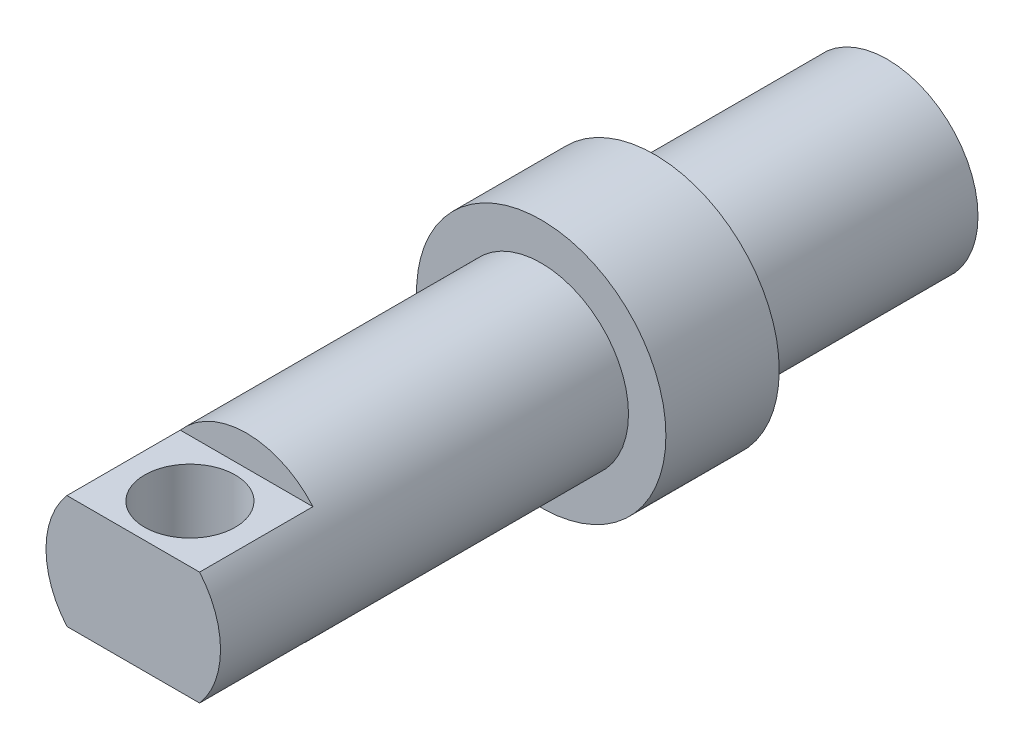
ISO-10303-21;
HEADER;
FILE_DESCRIPTION(('STEP AP214'),'2;1');
FILE_NAME('part.step','',(''),(''),'','','');
FILE_SCHEMA(('AUTOMOTIVE_DESIGN { 1 0 10303 214 1 1 1 1 }'));
ENDSEC;
DATA;
#1=APPLICATION_CONTEXT('core data for automotive mechanical design processes');
#2=APPLICATION_PROTOCOL_DEFINITION('international standard','automotive_design',2000,#1);
#3=PRODUCT_CONTEXT('',#1,'mechanical');
#4=PRODUCT('Part','Part','',(#3));
#5=PRODUCT_RELATED_PRODUCT_CATEGORY('part','',(#4));
#6=PRODUCT_DEFINITION_FORMATION('','',#4);
#7=PRODUCT_DEFINITION_CONTEXT('part definition',#1,'design');
#8=PRODUCT_DEFINITION('design','',#6,#7);
#9=PRODUCT_DEFINITION_SHAPE('','',#8);
#10=(LENGTH_UNIT() NAMED_UNIT(*) SI_UNIT(.MILLI.,.METRE.));
#11=(NAMED_UNIT(*) PLANE_ANGLE_UNIT() SI_UNIT($,.RADIAN.));
#12=(NAMED_UNIT(*) SI_UNIT($,.STERADIAN.) SOLID_ANGLE_UNIT());
#13=UNCERTAINTY_MEASURE_WITH_UNIT(LENGTH_MEASURE(1.E-05),#10,'distance_accuracy_value','');
#14=(GEOMETRIC_REPRESENTATION_CONTEXT(3) GLOBAL_UNCERTAINTY_ASSIGNED_CONTEXT((#13)) GLOBAL_UNIT_ASSIGNED_CONTEXT((#10,
#11,#12)) REPRESENTATION_CONTEXT('',''));
#15=CARTESIAN_POINT('',(0.,0.,0.));
#16=DIRECTION('',(0.,0.,1.));
#17=DIRECTION('',(1.,0.,0.));
#18=AXIS2_PLACEMENT_3D('',#15,#16,#17);
#19=CARTESIAN_POINT('',(0.,7.15,19.77));
#20=DIRECTION('',(0.,0.,1.));
#21=DIRECTION('',(1.,0.,0.));
#22=AXIS2_PLACEMENT_3D('',#19,#20,#21);
#23=PLANE('',#22);
#24=CARTESIAN_POINT('',(0.,7.15,19.77));
#25=DIRECTION('',(0.,0.,1.));
#26=DIRECTION('',(1.,0.,0.));
#27=AXIS2_PLACEMENT_3D('',#24,#25,#26);
#28=CIRCLE('',#27,3.85);
#29=CARTESIAN_POINT('',(2.92617170234075,9.65200303125721,19.77));
#30=VERTEX_POINT('',#29);
#31=CARTESIAN_POINT('',(-2.92617170234075,9.65200303125721,19.77));
#32=VERTEX_POINT('',#31);
#33=EDGE_CURVE('E114',#30,#32,#28,.T.);
#34=ORIENTED_EDGE('',*,*,#33,.T.);
#35=DIRECTION('',(1.,0.,0.));
#36=VECTOR('',#35,1.);
#37=CARTESIAN_POINT('',(0.,9.65200303125721,19.77));
#38=LINE('',#37,#36);
#39=EDGE_CURVE('E135',#32,#30,#38,.T.);
#40=ORIENTED_EDGE('',*,*,#39,.T.);
#41=EDGE_LOOP('',(#34,#40));
#42=FACE_BOUND('',#41,.T.);
#43=ADVANCED_FACE('F17',(#42),#23,.T.);
#44=CARTESIAN_POINT('',(0.,7.15,1.77));
#45=DIRECTION('',(0.,0.,-1.));
#46=DIRECTION('',(-1.,0.,0.));
#47=AXIS2_PLACEMENT_3D('',#44,#45,#46);
#48=CYLINDRICAL_SURFACE('',#47,3.00000000000033);
#49=CARTESIAN_POINT('',(0.,7.15,-8.5));
#50=DIRECTION('',(0.,0.,1.));
#51=DIRECTION('',(1.,0.,0.));
#52=AXIS2_PLACEMENT_3D('',#49,#50,#51);
#53=CIRCLE('',#52,3.00000000000033);
#54=CARTESIAN_POINT('',(-2.99984998124639,7.1199984997371,-8.5));
#55=VERTEX_POINT('',#54);
#56=CARTESIAN_POINT('',(-0.0300015002628589,4.15015001875363,-8.5));
#57=VERTEX_POINT('',#56);
#58=EDGE_CURVE('E84',#55,#57,#53,.T.);
#59=ORIENTED_EDGE('',*,*,#58,.F.);
#60=DIRECTION('',(0.,0.,-1.));
#61=VECTOR('',#60,1.);
#62=CARTESIAN_POINT('',(-2.99984998124639,7.1199984997371,1.77));
#63=LINE('',#62,#61);
#64=CARTESIAN_POINT('',(-2.99984998124639,7.1199984997371,1.77));
#65=VERTEX_POINT('',#64);
#66=EDGE_CURVE('E26',#65,#55,#63,.T.);
#67=ORIENTED_EDGE('',*,*,#66,.F.);
#68=CARTESIAN_POINT('',(0.,7.15,1.77));
#69=DIRECTION('',(0.,0.,1.));
#70=DIRECTION('',(1.,0.,0.));
#71=AXIS2_PLACEMENT_3D('',#68,#69,#70);
#72=CIRCLE('',#71,3.00000000000033);
#73=CARTESIAN_POINT('',(-0.0300015002628589,4.15015001875363,1.77));
#74=VERTEX_POINT('',#73);
#75=EDGE_CURVE('E88',#65,#74,#72,.T.);
#76=ORIENTED_EDGE('',*,*,#75,.T.);
#77=DIRECTION('',(0.,0.,-1.));
#78=VECTOR('',#77,1.);
#79=CARTESIAN_POINT('',(-0.0300015002628589,4.15015001875363,1.77));
#80=LINE('',#79,#78);
#81=EDGE_CURVE('E70',#74,#57,#80,.T.);
#82=ORIENTED_EDGE('',*,*,#81,.T.);
#83=EDGE_LOOP('',(#59,#67,#76,#82));
#84=FACE_BOUND('',#83,.T.);
#85=ADVANCED_FACE('F100',(#84),#48,.F.);
#86=CARTESIAN_POINT('',(-5.05992424049177,5.05992424049168,1.77));
#87=DIRECTION('',(0.707106781186554,-0.707106781186541,0.));
#88=DIRECTION('',(0.707106781186541,0.707106781186554,0.));
#89=AXIS2_PLACEMENT_3D('',#86,#87,#88);
#90=PLANE('',#89);
#91=DIRECTION('',(-0.707106781186541,-0.707106781186554,0.));
#92=VECTOR('',#91,1.);
#93=CARTESIAN_POINT('',(-5.05992424049177,5.05992424049168,-8.5));
#94=LINE('',#93,#92);
#95=CARTESIAN_POINT('',(0.0300015002628607,10.1498499812464,-8.5));
#96=VERTEX_POINT('',#95);
#97=EDGE_CURVE('E79',#96,#55,#94,.T.);
#98=ORIENTED_EDGE('',*,*,#97,.F.);
#99=DIRECTION('',(0.,0.,-1.));
#100=VECTOR('',#99,1.);
#101=CARTESIAN_POINT('',(0.0300015002628607,10.1498499812464,1.77));
#102=LINE('',#101,#100);
#103=CARTESIAN_POINT('',(0.0300015002628607,10.1498499812464,1.77));
#104=VERTEX_POINT('',#103);
#105=EDGE_CURVE('E69',#104,#96,#102,.T.);
#106=ORIENTED_EDGE('',*,*,#105,.F.);
#107=DIRECTION('',(-0.707106781186541,-0.707106781186554,0.));
#108=VECTOR('',#107,1.);
#109=CARTESIAN_POINT('',(-5.05992424049177,5.05992424049168,1.77));
#110=LINE('',#109,#108);
#111=EDGE_CURVE('E97',#104,#65,#110,.T.);
#112=ORIENTED_EDGE('',*,*,#111,.T.);
#113=ORIENTED_EDGE('',*,*,#66,.T.);
#114=EDGE_LOOP('',(#98,#106,#112,#113));
#115=FACE_BOUND('',#114,.T.);
#116=ADVANCED_FACE('F96',(#115),#90,.T.);
#117=CARTESIAN_POINT('',(0.,7.15,1.77));
#118=DIRECTION('',(0.,0.,-1.));
#119=DIRECTION('',(-1.,0.,0.));
#120=AXIS2_PLACEMENT_3D('',#117,#118,#119);
#121=CYLINDRICAL_SURFACE('',#120,3.00000000000033);
#122=CARTESIAN_POINT('',(0.,7.15,-8.5));
#123=DIRECTION('',(0.,0.,1.));
#124=DIRECTION('',(1.,0.,0.));
#125=AXIS2_PLACEMENT_3D('',#122,#123,#124);
#126=CIRCLE('',#125,3.00000000000033);
#127=CARTESIAN_POINT('',(2.99984998124639,7.18000150026292,-8.5));
#128=VERTEX_POINT('',#127);
#129=EDGE_CURVE('E73',#128,#96,#126,.T.);
#130=ORIENTED_EDGE('',*,*,#129,.F.);
#131=DIRECTION('',(0.,0.,-1.));
#132=VECTOR('',#131,1.);
#133=CARTESIAN_POINT('',(2.99984998124639,7.18000150026292,1.77));
#134=LINE('',#133,#132);
#135=CARTESIAN_POINT('',(2.99984998124639,7.18000150026292,1.77));
#136=VERTEX_POINT('',#135);
#137=EDGE_CURVE('E61',#136,#128,#134,.T.);
#138=ORIENTED_EDGE('',*,*,#137,.F.);
#139=CARTESIAN_POINT('',(0.,7.15,1.77));
#140=DIRECTION('',(0.,0.,1.));
#141=DIRECTION('',(1.,0.,0.));
#142=AXIS2_PLACEMENT_3D('',#139,#140,#141);
#143=CIRCLE('',#142,3.00000000000033);
#144=EDGE_CURVE('E43',#136,#104,#143,.T.);
#145=ORIENTED_EDGE('',*,*,#144,.T.);
#146=ORIENTED_EDGE('',*,*,#105,.T.);
#147=EDGE_LOOP('',(#130,#138,#145,#146));
#148=FACE_BOUND('',#147,.T.);
#149=ADVANCED_FACE('F74',(#148),#121,.F.);
#150=CARTESIAN_POINT('',(0.,7.15,1.77));
#151=DIRECTION('',(0.,0.,-1.));
#152=DIRECTION('',(-1.,0.,0.));
#153=AXIS2_PLACEMENT_3D('',#150,#151,#152);
#154=CYLINDRICAL_SURFACE('',#153,4.);
#155=CARTESIAN_POINT('',(0.,7.15,1.77));
#156=DIRECTION('',(0.,0.,1.));
#157=DIRECTION('',(1.,0.,0.));
#158=AXIS2_PLACEMENT_3D('',#155,#156,#157);
#159=CIRCLE('',#158,4.);
#160=CARTESIAN_POINT('',(4.,7.15,1.77));
#161=VERTEX_POINT('',#160);
#162=EDGE_CURVE('E85',#161,#161,#159,.T.);
#163=ORIENTED_EDGE('',*,*,#162,.F.);
#164=EDGE_LOOP('',(#163));
#165=FACE_BOUND('',#164,.T.);
#166=CARTESIAN_POINT('',(0.,7.15,-8.5));
#167=DIRECTION('',(0.,0.,1.));
#168=DIRECTION('',(1.,0.,0.));
#169=AXIS2_PLACEMENT_3D('',#166,#167,#168);
#170=CIRCLE('',#169,4.);
#171=CARTESIAN_POINT('',(4.,7.15,-8.5));
#172=VERTEX_POINT('',#171);
#173=EDGE_CURVE('E101',#172,#172,#170,.T.);
#174=ORIENTED_EDGE('',*,*,#173,.T.);
#175=EDGE_LOOP('',(#174));
#176=FACE_BOUND('',#175,.T.);
#177=ADVANCED_FACE('F19',(#165,#176),#154,.T.);
#178=CARTESIAN_POINT('',(-2.09007575950824,2.0900757595082,1.77));
#179=DIRECTION('',(-0.707106781186554,0.707106781186542,0.));
#180=DIRECTION('',(-0.707106781186541,-0.707106781186554,0.));
#181=AXIS2_PLACEMENT_3D('',#178,#179,#180);
#182=PLANE('',#181);
#183=DIRECTION('',(0.707106781186542,0.707106781186554,0.));
#184=VECTOR('',#183,1.);
#185=CARTESIAN_POINT('',(-2.09007575950824,2.0900757595082,-8.5));
#186=LINE('',#185,#184);
#187=EDGE_CURVE('E66',#57,#128,#186,.T.);
#188=ORIENTED_EDGE('',*,*,#187,.F.);
#189=ORIENTED_EDGE('',*,*,#81,.F.);
#190=DIRECTION('',(0.707106781186542,0.707106781186554,0.));
#191=VECTOR('',#190,1.);
#192=CARTESIAN_POINT('',(-2.09007575950824,2.0900757595082,1.77));
#193=LINE('',#192,#191);
#194=EDGE_CURVE('E67',#74,#136,#193,.T.);
#195=ORIENTED_EDGE('',*,*,#194,.T.);
#196=ORIENTED_EDGE('',*,*,#137,.T.);
#197=EDGE_LOOP('',(#188,#189,#195,#196));
#198=FACE_BOUND('',#197,.T.);
#199=ADVANCED_FACE('F63',(#198),#182,.T.);
#200=CARTESIAN_POINT('',(0.,0.,-8.5));
#201=DIRECTION('',(0.,0.,1.));
#202=DIRECTION('',(1.,0.,0.));
#203=AXIS2_PLACEMENT_3D('',#200,#201,#202);
#204=PLANE('',#203);
#205=ORIENTED_EDGE('',*,*,#173,.F.);
#206=EDGE_LOOP('',(#205));
#207=FACE_BOUND('',#206,.T.);
#208=ORIENTED_EDGE('',*,*,#58,.T.);
#209=ORIENTED_EDGE('',*,*,#187,.T.);
#210=ORIENTED_EDGE('',*,*,#129,.T.);
#211=ORIENTED_EDGE('',*,*,#97,.T.);
#212=EDGE_LOOP('',(#208,#209,#210,#211));
#213=FACE_BOUND('',#212,.T.);
#214=ADVANCED_FACE('F82',(#207,#213),#204,.F.);
#215=CARTESIAN_POINT('',(0.,7.15,1.77));
#216=DIRECTION('',(0.,0.,1.));
#217=DIRECTION('',(1.,0.,0.));
#218=AXIS2_PLACEMENT_3D('',#215,#216,#217);
#219=PLANE('',#218);
#220=ORIENTED_EDGE('',*,*,#75,.F.);
#221=ORIENTED_EDGE('',*,*,#111,.F.);
#222=ORIENTED_EDGE('',*,*,#144,.F.);
#223=ORIENTED_EDGE('',*,*,#194,.F.);
#224=EDGE_LOOP('',(#220,#221,#222,#223));
#225=FACE_BOUND('',#224,.T.);
#226=ADVANCED_FACE('F216',(#225),#219,.F.);
#227=CARTESIAN_POINT('',(0.,7.15,1.77));
#228=DIRECTION('',(0.,0.,1.));
#229=DIRECTION('',(1.,0.,0.));
#230=AXIS2_PLACEMENT_3D('',#227,#228,#229);
#231=CIRCLE('',#230,5.5);
#232=CARTESIAN_POINT('',(5.5,7.15,1.77));
#233=VERTEX_POINT('',#232);
#234=EDGE_CURVE('E111',#233,#233,#231,.T.);
#235=ORIENTED_EDGE('',*,*,#234,.F.);
#236=EDGE_LOOP('',(#235));
#237=FACE_BOUND('',#236,.T.);
#238=ORIENTED_EDGE('',*,*,#162,.T.);
#239=EDGE_LOOP('',(#238));
#240=FACE_BOUND('',#239,.T.);
#241=ADVANCED_FACE('F218',(#237,#240),#219,.F.);
#242=CARTESIAN_POINT('',(0.,7.15,6.77));
#243=DIRECTION('',(0.,0.,-1.));
#244=DIRECTION('',(-1.,0.,0.));
#245=AXIS2_PLACEMENT_3D('',#242,#243,#244);
#246=CYLINDRICAL_SURFACE('',#245,5.5);
#247=CARTESIAN_POINT('',(0.,7.15,6.77));
#248=DIRECTION('',(0.,0.,1.));
#249=DIRECTION('',(1.,0.,0.));
#250=AXIS2_PLACEMENT_3D('',#247,#248,#249);
#251=CIRCLE('',#250,5.5);
#252=CARTESIAN_POINT('',(5.5,7.15,6.77));
#253=VERTEX_POINT('',#252);
#254=EDGE_CURVE('E106',#253,#253,#251,.T.);
#255=ORIENTED_EDGE('',*,*,#254,.F.);
#256=EDGE_LOOP('',(#255));
#257=FACE_BOUND('',#256,.T.);
#258=ORIENTED_EDGE('',*,*,#234,.T.);
#259=EDGE_LOOP('',(#258));
#260=FACE_BOUND('',#259,.T.);
#261=ADVANCED_FACE('F225',(#257,#260),#246,.T.);
#262=CARTESIAN_POINT('',(0.,7.15,6.77));
#263=DIRECTION('',(0.,0.,1.));
#264=DIRECTION('',(1.,0.,0.));
#265=AXIS2_PLACEMENT_3D('',#262,#263,#264);
#266=PLANE('',#265);
#267=CARTESIAN_POINT('',(0.,7.15,6.77));
#268=DIRECTION('',(0.,0.,1.));
#269=DIRECTION('',(1.,0.,0.));
#270=AXIS2_PLACEMENT_3D('',#267,#268,#269);
#271=CIRCLE('',#270,3.85);
#272=CARTESIAN_POINT('',(3.85,7.15,6.77));
#273=VERTEX_POINT('',#272);
#274=EDGE_CURVE('E11',#273,#273,#271,.T.);
#275=ORIENTED_EDGE('',*,*,#274,.F.);
#276=EDGE_LOOP('',(#275));
#277=FACE_BOUND('',#276,.T.);
#278=ORIENTED_EDGE('',*,*,#254,.T.);
#279=EDGE_LOOP('',(#278));
#280=FACE_BOUND('',#279,.T.);
#281=ADVANCED_FACE('F187',(#277,#280),#266,.T.);
#282=CARTESIAN_POINT('',(0.,7.15,19.77));
#283=DIRECTION('',(0.,0.,-1.));
#284=DIRECTION('',(-1.,0.,0.));
#285=AXIS2_PLACEMENT_3D('',#282,#283,#284);
#286=CYLINDRICAL_SURFACE('',#285,3.85);
#287=ORIENTED_EDGE('',*,*,#33,.F.);
#288=DIRECTION('',(0.,0.,-1.));
#289=VECTOR('',#288,1.);
#290=CARTESIAN_POINT('',(2.92617170234075,9.65200303125721,24.77));
#291=LINE('',#290,#289);
#292=CARTESIAN_POINT('',(2.92617170234075,9.65200303125721,24.77));
#293=VERTEX_POINT('',#292);
#294=EDGE_CURVE('E34',#293,#30,#291,.T.);
#295=ORIENTED_EDGE('',*,*,#294,.F.);
#296=CARTESIAN_POINT('',(0.,7.15,24.77));
#297=DIRECTION('',(0.,0.,1.));
#298=DIRECTION('',(1.,0.,0.));
#299=AXIS2_PLACEMENT_3D('',#296,#297,#298);
#300=CIRCLE('',#299,3.85);
#301=CARTESIAN_POINT('',(2.92617170234075,4.64799696874281,24.77));
#302=VERTEX_POINT('',#301);
#303=EDGE_CURVE('E134',#302,#293,#300,.T.);
#304=ORIENTED_EDGE('',*,*,#303,.F.);
#305=DIRECTION('',(0.,0.,-1.));
#306=VECTOR('',#305,1.);
#307=CARTESIAN_POINT('',(2.92617170234075,4.64799696874281,24.77));
#308=LINE('',#307,#306);
#309=CARTESIAN_POINT('',(2.92617170234075,4.64799696874281,19.77));
#310=VERTEX_POINT('',#309);
#311=EDGE_CURVE('E127',#302,#310,#308,.T.);
#312=ORIENTED_EDGE('',*,*,#311,.T.);
#313=CARTESIAN_POINT('',(-2.92617170234075,4.64799696874281,19.77));
#314=VERTEX_POINT('',#313);
#315=EDGE_CURVE('E119',#314,#310,#28,.T.);
#316=ORIENTED_EDGE('',*,*,#315,.F.);
#317=DIRECTION('',(0.,0.,-1.));
#318=VECTOR('',#317,1.);
#319=CARTESIAN_POINT('',(-2.92617170234075,4.64799696874281,24.77));
#320=LINE('',#319,#318);
#321=CARTESIAN_POINT('',(-2.92617170234075,4.64799696874281,24.77));
#322=VERTEX_POINT('',#321);
#323=EDGE_CURVE('E124',#322,#314,#320,.T.);
#324=ORIENTED_EDGE('',*,*,#323,.F.);
#325=CARTESIAN_POINT('',(0.,7.15,24.77));
#326=DIRECTION('',(0.,0.,1.));
#327=DIRECTION('',(1.,0.,0.));
#328=AXIS2_PLACEMENT_3D('',#325,#326,#327);
#329=CIRCLE('',#328,3.85);
#330=CARTESIAN_POINT('',(-2.92617170234075,9.65200303125721,24.77));
#331=VERTEX_POINT('',#330);
#332=EDGE_CURVE('E139',#331,#322,#329,.T.);
#333=ORIENTED_EDGE('',*,*,#332,.F.);
#334=DIRECTION('',(0.,0.,-1.));
#335=VECTOR('',#334,1.);
#336=CARTESIAN_POINT('',(-2.92617170234075,9.65200303125721,24.77));
#337=LINE('',#336,#335);
#338=EDGE_CURVE('E121',#331,#32,#337,.T.);
#339=ORIENTED_EDGE('',*,*,#338,.T.);
#340=EDGE_LOOP('',(#287,#295,#304,#312,#316,#324,#333,#339));
#341=FACE_BOUND('',#340,.T.);
#342=ORIENTED_EDGE('',*,*,#274,.T.);
#343=EDGE_LOOP('',(#342));
#344=FACE_BOUND('',#343,.T.);
#345=ADVANCED_FACE('F179',(#341,#344),#286,.T.);
#346=DIRECTION('',(1.,0.,0.));
#347=VECTOR('',#346,1.);
#348=CARTESIAN_POINT('',(0.,4.64799696874281,19.77));
#349=LINE('',#348,#347);
#350=EDGE_CURVE('E131',#314,#310,#349,.T.);
#351=ORIENTED_EDGE('',*,*,#350,.F.);
#352=ORIENTED_EDGE('',*,*,#315,.T.);
#353=EDGE_LOOP('',(#351,#352));
#354=FACE_BOUND('',#353,.T.);
#355=ADVANCED_FACE('F170',(#354),#23,.T.);
#356=CARTESIAN_POINT('',(0.,9.65200303125721,24.77));
#357=DIRECTION('',(0.,1.,0.));
#358=DIRECTION('',(0.,0.,1.));
#359=AXIS2_PLACEMENT_3D('',#356,#357,#358);
#360=PLANE('',#359);
#361=CARTESIAN_POINT('',(0.,9.65200303125721,22.27));
#362=DIRECTION('',(0.,1.,0.));
#363=DIRECTION('',(0.,0.,1.));
#364=AXIS2_PLACEMENT_3D('',#361,#362,#363);
#365=CIRCLE('',#364,2.);
#366=CARTESIAN_POINT('',(0.,9.65200303125721,24.27));
#367=VERTEX_POINT('',#366);
#368=EDGE_CURVE('E146',#367,#367,#365,.T.);
#369=ORIENTED_EDGE('',*,*,#368,.F.);
#370=EDGE_LOOP('',(#369));
#371=FACE_BOUND('',#370,.T.);
#372=ORIENTED_EDGE('',*,*,#39,.F.);
#373=ORIENTED_EDGE('',*,*,#338,.F.);
#374=DIRECTION('',(1.,0.,0.));
#375=VECTOR('',#374,1.);
#376=CARTESIAN_POINT('',(0.,9.65200303125721,24.77));
#377=LINE('',#376,#375);
#378=EDGE_CURVE('E142',#331,#293,#377,.T.);
#379=ORIENTED_EDGE('',*,*,#378,.T.);
#380=ORIENTED_EDGE('',*,*,#294,.T.);
#381=EDGE_LOOP('',(#372,#373,#379,#380));
#382=FACE_BOUND('',#381,.T.);
#383=ADVANCED_FACE('F178',(#371,#382),#360,.T.);
#384=CARTESIAN_POINT('',(0.,4.64799696874281,24.77));
#385=DIRECTION('',(0.,1.,0.));
#386=DIRECTION('',(0.,0.,1.));
#387=AXIS2_PLACEMENT_3D('',#384,#385,#386);
#388=PLANE('',#387);
#389=CARTESIAN_POINT('',(0.,4.64799696874281,22.27));
#390=DIRECTION('',(0.,1.,0.));
#391=DIRECTION('',(0.,0.,1.));
#392=AXIS2_PLACEMENT_3D('',#389,#390,#391);
#393=CIRCLE('',#392,2.);
#394=CARTESIAN_POINT('',(0.,4.64799696874281,24.27));
#395=VERTEX_POINT('',#394);
#396=EDGE_CURVE('E21',#395,#395,#393,.T.);
#397=ORIENTED_EDGE('',*,*,#396,.T.);
#398=EDGE_LOOP('',(#397));
#399=FACE_BOUND('',#398,.T.);
#400=ORIENTED_EDGE('',*,*,#350,.T.);
#401=ORIENTED_EDGE('',*,*,#311,.F.);
#402=DIRECTION('',(1.,0.,0.));
#403=VECTOR('',#402,1.);
#404=CARTESIAN_POINT('',(0.,4.64799696874281,24.77));
#405=LINE('',#404,#403);
#406=EDGE_CURVE('E130',#322,#302,#405,.T.);
#407=ORIENTED_EDGE('',*,*,#406,.F.);
#408=ORIENTED_EDGE('',*,*,#323,.T.);
#409=EDGE_LOOP('',(#400,#401,#407,#408));
#410=FACE_BOUND('',#409,.T.);
#411=ADVANCED_FACE('F153',(#399,#410),#388,.F.);
#412=CARTESIAN_POINT('',(0.,0.,24.77));
#413=DIRECTION('',(0.,0.,1.));
#414=DIRECTION('',(1.,0.,0.));
#415=AXIS2_PLACEMENT_3D('',#412,#413,#414);
#416=PLANE('',#415);
#417=ORIENTED_EDGE('',*,*,#303,.T.);
#418=ORIENTED_EDGE('',*,*,#378,.F.);
#419=ORIENTED_EDGE('',*,*,#332,.T.);
#420=ORIENTED_EDGE('',*,*,#406,.T.);
#421=EDGE_LOOP('',(#417,#418,#419,#420));
#422=FACE_BOUND('',#421,.T.);
#423=ADVANCED_FACE('F158',(#422),#416,.T.);
#424=CARTESIAN_POINT('',(0.,0.652003031257214,22.27));
#425=DIRECTION('',(0.,1.,0.));
#426=DIRECTION('',(0.,0.,1.));
#427=AXIS2_PLACEMENT_3D('',#424,#425,#426);
#428=CYLINDRICAL_SURFACE('',#427,2.);
#429=ORIENTED_EDGE('',*,*,#368,.T.);
#430=EDGE_LOOP('',(#429));
#431=FACE_BOUND('',#430,.T.);
#432=ORIENTED_EDGE('',*,*,#396,.F.);
#433=EDGE_LOOP('',(#432));
#434=FACE_BOUND('',#433,.T.);
#435=ADVANCED_FACE('F156',(#431,#434),#428,.F.);
#436=CLOSED_SHELL('',(#43,#85,#116,#149,#177,#199,#214,#226,#241,#261,#281,#345,#355,#383,#411,
#423,#435));
#437=MANIFOLD_SOLID_BREP('B1',#436);
#438=ADVANCED_BREP_SHAPE_REPRESENTATION('',(#18,#437),#14);
#439=SHAPE_DEFINITION_REPRESENTATION(#9,#438);
ENDSEC;
END-ISO-10303-21;
